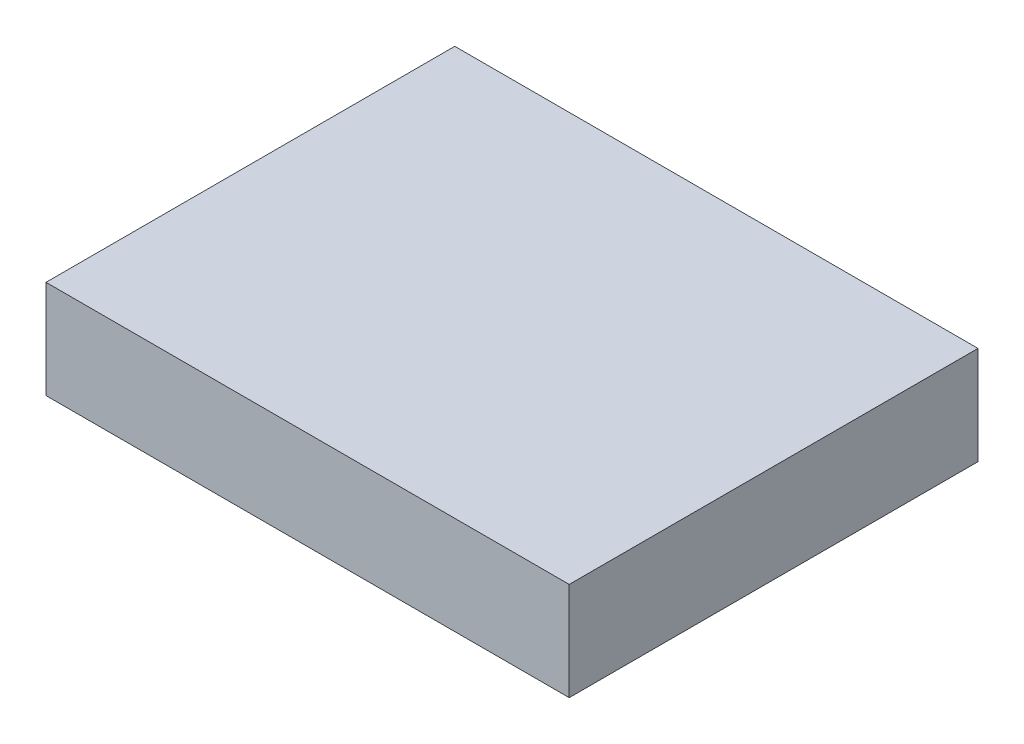
ISO-10303-21;
HEADER;
FILE_DESCRIPTION(('STEP AP214'),'2;1');
FILE_NAME('part.step','',(''),(''),'','','');
FILE_SCHEMA(('AUTOMOTIVE_DESIGN { 1 0 10303 214 1 1 1 1 }'));
ENDSEC;
DATA;
#1=APPLICATION_CONTEXT('core data for automotive mechanical design processes');
#2=APPLICATION_PROTOCOL_DEFINITION('international standard','automotive_design',2000,#1);
#3=PRODUCT_CONTEXT('',#1,'mechanical');
#4=PRODUCT('Part','Part','',(#3));
#5=PRODUCT_RELATED_PRODUCT_CATEGORY('part','',(#4));
#6=PRODUCT_DEFINITION_FORMATION('','',#4);
#7=PRODUCT_DEFINITION_CONTEXT('part definition',#1,'design');
#8=PRODUCT_DEFINITION('design','',#6,#7);
#9=PRODUCT_DEFINITION_SHAPE('','',#8);
#10=(LENGTH_UNIT() NAMED_UNIT(*) SI_UNIT(.MILLI.,.METRE.));
#11=(NAMED_UNIT(*) PLANE_ANGLE_UNIT() SI_UNIT($,.RADIAN.));
#12=(NAMED_UNIT(*) SI_UNIT($,.STERADIAN.) SOLID_ANGLE_UNIT());
#13=UNCERTAINTY_MEASURE_WITH_UNIT(LENGTH_MEASURE(1.E-05),#10,'distance_accuracy_value','');
#14=(GEOMETRIC_REPRESENTATION_CONTEXT(3) GLOBAL_UNCERTAINTY_ASSIGNED_CONTEXT((#13)) GLOBAL_UNIT_ASSIGNED_CONTEXT((#10,
#11,#12)) REPRESENTATION_CONTEXT('',''));
#15=CARTESIAN_POINT('',(0.,0.,0.));
#16=DIRECTION('',(0.,0.,1.));
#17=DIRECTION('',(1.,0.,0.));
#18=AXIS2_PLACEMENT_3D('',#15,#16,#17);
#19=CARTESIAN_POINT('',(0.,0.6,0.));
#20=DIRECTION('',(0.,-1.,0.));
#21=DIRECTION('',(0.,0.,-1.));
#22=AXIS2_PLACEMENT_3D('',#19,#20,#21);
#23=PLANE('',#22);
#24=DIRECTION('',(1.,0.,0.));
#25=VECTOR('',#24,1.);
#26=CARTESIAN_POINT('',(-1.6,0.6,-1.25));
#27=LINE('',#26,#25);
#28=CARTESIAN_POINT('',(1.6,0.6,-1.25));
#29=VERTEX_POINT('',#28);
#30=CARTESIAN_POINT('',(-1.6,0.6,-1.25));
#31=VERTEX_POINT('',#30);
#32=EDGE_CURVE('E80',#29,#31,#27,.F.);
#33=ORIENTED_EDGE('',*,*,#32,.T.);
#34=DIRECTION('',(0.,0.,-1.));
#35=VECTOR('',#34,1.);
#36=CARTESIAN_POINT('',(-1.6,0.6,1.25));
#37=LINE('',#36,#35);
#38=CARTESIAN_POINT('',(-1.6,0.6,1.25));
#39=VERTEX_POINT('',#38);
#40=EDGE_CURVE('E55',#31,#39,#37,.F.);
#41=ORIENTED_EDGE('',*,*,#40,.T.);
#42=DIRECTION('',(-1.,0.,0.));
#43=VECTOR('',#42,1.);
#44=CARTESIAN_POINT('',(-1.6,0.6,1.25));
#45=LINE('',#44,#43);
#46=CARTESIAN_POINT('',(1.6,0.6,1.25));
#47=VERTEX_POINT('',#46);
#48=EDGE_CURVE('E57',#39,#47,#45,.F.);
#49=ORIENTED_EDGE('',*,*,#48,.T.);
#50=DIRECTION('',(0.,0.,1.));
#51=VECTOR('',#50,1.);
#52=CARTESIAN_POINT('',(1.6,0.6,1.25));
#53=LINE('',#52,#51);
#54=EDGE_CURVE('E20',#47,#29,#53,.F.);
#55=ORIENTED_EDGE('',*,*,#54,.T.);
#56=EDGE_LOOP('',(#33,#41,#49,#55));
#57=FACE_BOUND('',#56,.T.);
#58=ADVANCED_FACE('F17',(#57),#23,.F.);
#59=CARTESIAN_POINT('',(1.6,0.6,1.25));
#60=DIRECTION('',(-1.,0.,0.));
#61=DIRECTION('',(0.,0.,1.));
#62=AXIS2_PLACEMENT_3D('',#59,#60,#61);
#63=PLANE('',#62);
#64=DIRECTION('',(0.,1.,0.));
#65=VECTOR('',#64,1.);
#66=CARTESIAN_POINT('',(1.6,0.6,-1.25));
#67=LINE('',#66,#65);
#68=CARTESIAN_POINT('',(1.6,0.,-1.25));
#69=VERTEX_POINT('',#68);
#70=EDGE_CURVE('E68',#69,#29,#67,.T.);
#71=ORIENTED_EDGE('',*,*,#70,.T.);
#72=ORIENTED_EDGE('',*,*,#54,.F.);
#73=DIRECTION('',(0.,1.,0.));
#74=VECTOR('',#73,1.);
#75=CARTESIAN_POINT('',(1.6,0.6,1.25));
#76=LINE('',#75,#74);
#77=CARTESIAN_POINT('',(1.6,0.,1.25));
#78=VERTEX_POINT('',#77);
#79=EDGE_CURVE('E63',#47,#78,#76,.F.);
#80=ORIENTED_EDGE('',*,*,#79,.T.);
#81=DIRECTION('',(0.,0.,-1.));
#82=VECTOR('',#81,1.);
#83=CARTESIAN_POINT('',(1.6,0.,0.));
#84=LINE('',#83,#82);
#85=EDGE_CURVE('E83',#69,#78,#84,.F.);
#86=ORIENTED_EDGE('',*,*,#85,.F.);
#87=EDGE_LOOP('',(#71,#72,#80,#86));
#88=FACE_BOUND('',#87,.T.);
#89=ADVANCED_FACE('F65',(#88),#63,.F.);
#90=CARTESIAN_POINT('',(-1.6,0.6,1.25));
#91=DIRECTION('',(0.,0.,-1.));
#92=DIRECTION('',(-1.,0.,0.));
#93=AXIS2_PLACEMENT_3D('',#90,#91,#92);
#94=PLANE('',#93);
#95=ORIENTED_EDGE('',*,*,#79,.F.);
#96=ORIENTED_EDGE('',*,*,#48,.F.);
#97=DIRECTION('',(0.,1.,0.));
#98=VECTOR('',#97,1.);
#99=CARTESIAN_POINT('',(-1.6,0.6,1.25));
#100=LINE('',#99,#98);
#101=CARTESIAN_POINT('',(-1.6,0.,1.25));
#102=VERTEX_POINT('',#101);
#103=EDGE_CURVE('E75',#39,#102,#100,.F.);
#104=ORIENTED_EDGE('',*,*,#103,.T.);
#105=DIRECTION('',(1.,0.,0.));
#106=VECTOR('',#105,1.);
#107=CARTESIAN_POINT('',(0.,0.,1.25));
#108=LINE('',#107,#106);
#109=EDGE_CURVE('E72',#78,#102,#108,.F.);
#110=ORIENTED_EDGE('',*,*,#109,.F.);
#111=EDGE_LOOP('',(#95,#96,#104,#110));
#112=FACE_BOUND('',#111,.T.);
#113=ADVANCED_FACE('F70',(#112),#94,.F.);
#114=CARTESIAN_POINT('',(-1.6,0.6,1.25));
#115=DIRECTION('',(1.,0.,0.));
#116=DIRECTION('',(0.,0.,-1.));
#117=AXIS2_PLACEMENT_3D('',#114,#115,#116);
#118=PLANE('',#117);
#119=ORIENTED_EDGE('',*,*,#103,.F.);
#120=ORIENTED_EDGE('',*,*,#40,.F.);
#121=DIRECTION('',(0.,1.,0.));
#122=VECTOR('',#121,1.);
#123=CARTESIAN_POINT('',(-1.6,0.6,-1.25));
#124=LINE('',#123,#122);
#125=CARTESIAN_POINT('',(-1.6,0.,-1.25));
#126=VERTEX_POINT('',#125);
#127=EDGE_CURVE('E35',#31,#126,#124,.F.);
#128=ORIENTED_EDGE('',*,*,#127,.T.);
#129=DIRECTION('',(0.,0.,-1.));
#130=VECTOR('',#129,1.);
#131=CARTESIAN_POINT('',(-1.6,0.,0.));
#132=LINE('',#131,#130);
#133=EDGE_CURVE('E26',#102,#126,#132,.T.);
#134=ORIENTED_EDGE('',*,*,#133,.F.);
#135=EDGE_LOOP('',(#119,#120,#128,#134));
#136=FACE_BOUND('',#135,.T.);
#137=ADVANCED_FACE('F89',(#136),#118,.F.);
#138=CARTESIAN_POINT('',(-1.6,0.6,-1.25));
#139=DIRECTION('',(0.,0.,1.));
#140=DIRECTION('',(1.,0.,0.));
#141=AXIS2_PLACEMENT_3D('',#138,#139,#140);
#142=PLANE('',#141);
#143=ORIENTED_EDGE('',*,*,#127,.F.);
#144=ORIENTED_EDGE('',*,*,#32,.F.);
#145=ORIENTED_EDGE('',*,*,#70,.F.);
#146=DIRECTION('',(1.,0.,0.));
#147=VECTOR('',#146,1.);
#148=CARTESIAN_POINT('',(0.,0.,-1.25));
#149=LINE('',#148,#147);
#150=EDGE_CURVE('E11',#126,#69,#149,.T.);
#151=ORIENTED_EDGE('',*,*,#150,.F.);
#152=EDGE_LOOP('',(#143,#144,#145,#151));
#153=FACE_BOUND('',#152,.T.);
#154=ADVANCED_FACE('F91',(#153),#142,.F.);
#155=CARTESIAN_POINT('',(0.,0.,0.));
#156=DIRECTION('',(0.,-1.,0.));
#157=DIRECTION('',(0.,0.,-1.));
#158=AXIS2_PLACEMENT_3D('',#155,#156,#157);
#159=PLANE('',#158);
#160=ORIENTED_EDGE('',*,*,#133,.T.);
#161=ORIENTED_EDGE('',*,*,#150,.T.);
#162=ORIENTED_EDGE('',*,*,#85,.T.);
#163=ORIENTED_EDGE('',*,*,#109,.T.);
#164=EDGE_LOOP('',(#160,#161,#162,#163));
#165=FACE_BOUND('',#164,.T.);
#166=ADVANCED_FACE('F88',(#165),#159,.T.);
#167=CLOSED_SHELL('',(#58,#89,#113,#137,#154,#166));
#168=MANIFOLD_SOLID_BREP('B1',#167);
#169=ADVANCED_BREP_SHAPE_REPRESENTATION('',(#18,#168),#14);
#170=SHAPE_DEFINITION_REPRESENTATION(#9,#169);
ENDSEC;
END-ISO-10303-21;
